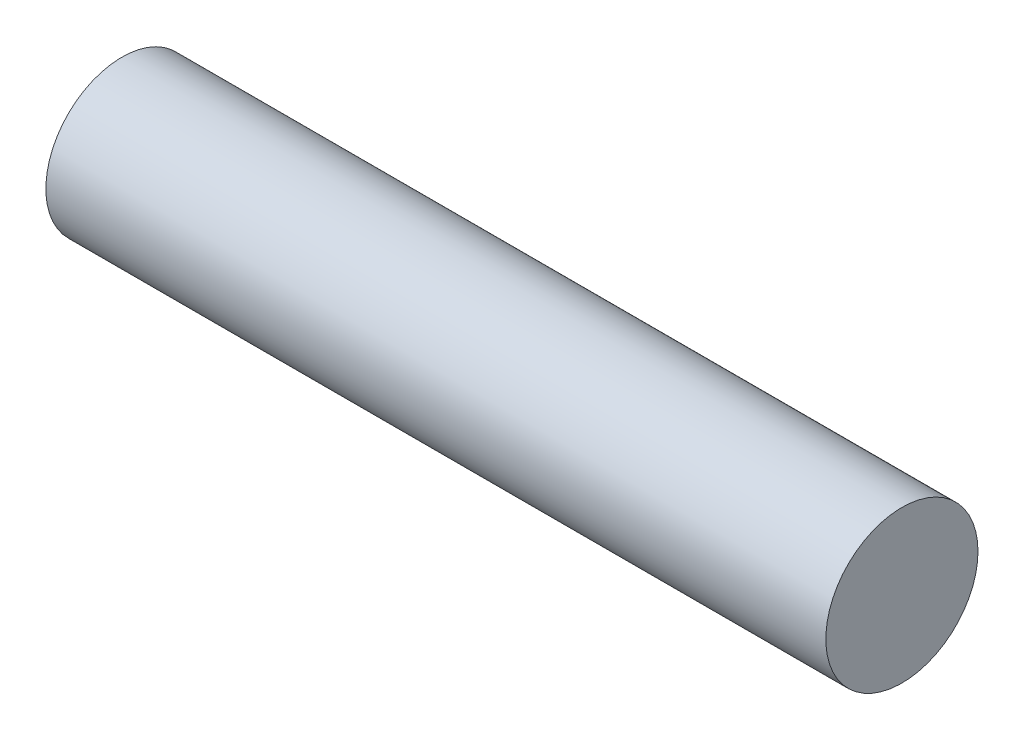
ISO-10303-21;
HEADER;
FILE_DESCRIPTION(('STEP AP214'),'2;1');
FILE_NAME('part.step','',(''),(''),'','','');
FILE_SCHEMA(('AUTOMOTIVE_DESIGN { 1 0 10303 214 1 1 1 1 }'));
ENDSEC;
DATA;
#1=APPLICATION_CONTEXT('core data for automotive mechanical design processes');
#2=APPLICATION_PROTOCOL_DEFINITION('international standard','automotive_design',2000,#1);
#3=PRODUCT_CONTEXT('',#1,'mechanical');
#4=PRODUCT('Part','Part','',(#3));
#5=PRODUCT_RELATED_PRODUCT_CATEGORY('part','',(#4));
#6=PRODUCT_DEFINITION_FORMATION('','',#4);
#7=PRODUCT_DEFINITION_CONTEXT('part definition',#1,'design');
#8=PRODUCT_DEFINITION('design','',#6,#7);
#9=PRODUCT_DEFINITION_SHAPE('','',#8);
#10=(LENGTH_UNIT() NAMED_UNIT(*) SI_UNIT(.MILLI.,.METRE.));
#11=(NAMED_UNIT(*) PLANE_ANGLE_UNIT() SI_UNIT($,.RADIAN.));
#12=(NAMED_UNIT(*) SI_UNIT($,.STERADIAN.) SOLID_ANGLE_UNIT());
#13=UNCERTAINTY_MEASURE_WITH_UNIT(LENGTH_MEASURE(1.E-05),#10,'distance_accuracy_value','');
#14=(GEOMETRIC_REPRESENTATION_CONTEXT(3) GLOBAL_UNCERTAINTY_ASSIGNED_CONTEXT((#13)) GLOBAL_UNIT_ASSIGNED_CONTEXT((#10,
#11,#12)) REPRESENTATION_CONTEXT('',''));
#15=CARTESIAN_POINT('',(0.,0.,0.));
#16=DIRECTION('',(0.,0.,1.));
#17=DIRECTION('',(1.,0.,0.));
#18=AXIS2_PLACEMENT_3D('',#15,#16,#17);
#19=CARTESIAN_POINT('',(1041.4,0.,0.));
#20=DIRECTION('',(-1.,0.,0.));
#21=DIRECTION('',(0.,0.,1.));
#22=AXIS2_PLACEMENT_3D('',#19,#20,#21);
#23=CYLINDRICAL_SURFACE('',#22,101.6);
#24=CARTESIAN_POINT('',(1041.4,0.,0.));
#25=DIRECTION('',(1.,0.,0.));
#26=DIRECTION('',(0.,0.,-1.));
#27=AXIS2_PLACEMENT_3D('',#24,#25,#26);
#28=CIRCLE('',#27,101.6);
#29=CARTESIAN_POINT('',(1041.4,0.,-101.6));
#30=VERTEX_POINT('',#29);
#31=EDGE_CURVE('E10',#30,#30,#28,.T.);
#32=ORIENTED_EDGE('',*,*,#31,.F.);
#33=EDGE_LOOP('',(#32));
#34=FACE_BOUND('',#33,.T.);
#35=CARTESIAN_POINT('',(0.,0.,0.));
#36=DIRECTION('',(1.,0.,0.));
#37=DIRECTION('',(0.,0.,-1.));
#38=AXIS2_PLACEMENT_3D('',#35,#36,#37);
#39=CIRCLE('',#38,101.6);
#40=CARTESIAN_POINT('',(0.,0.,-101.6));
#41=VERTEX_POINT('',#40);
#42=EDGE_CURVE('E34',#41,#41,#39,.T.);
#43=ORIENTED_EDGE('',*,*,#42,.T.);
#44=EDGE_LOOP('',(#43));
#45=FACE_BOUND('',#44,.T.);
#46=ADVANCED_FACE('F31',(#34,#45),#23,.T.);
#47=CARTESIAN_POINT('',(1041.4,0.,0.));
#48=DIRECTION('',(1.,0.,0.));
#49=DIRECTION('',(0.,0.,-1.));
#50=AXIS2_PLACEMENT_3D('',#47,#48,#49);
#51=PLANE('',#50);
#52=ORIENTED_EDGE('',*,*,#31,.T.);
#53=EDGE_LOOP('',(#52));
#54=FACE_BOUND('',#53,.T.);
#55=ADVANCED_FACE('F46',(#54),#51,.T.);
#56=CARTESIAN_POINT('',(0.,0.,0.));
#57=DIRECTION('',(1.,0.,0.));
#58=DIRECTION('',(0.,0.,-1.));
#59=AXIS2_PLACEMENT_3D('',#56,#57,#58);
#60=PLANE('',#59);
#61=ORIENTED_EDGE('',*,*,#42,.F.);
#62=EDGE_LOOP('',(#61));
#63=FACE_BOUND('',#62,.T.);
#64=ADVANCED_FACE('F44',(#63),#60,.F.);
#65=CLOSED_SHELL('',(#46,#55,#64));
#66=MANIFOLD_SOLID_BREP('B2',#65);
#67=ADVANCED_BREP_SHAPE_REPRESENTATION('',(#18,#66),#14);
#68=SHAPE_DEFINITION_REPRESENTATION(#9,#67);
ENDSEC;
END-ISO-10303-21;
